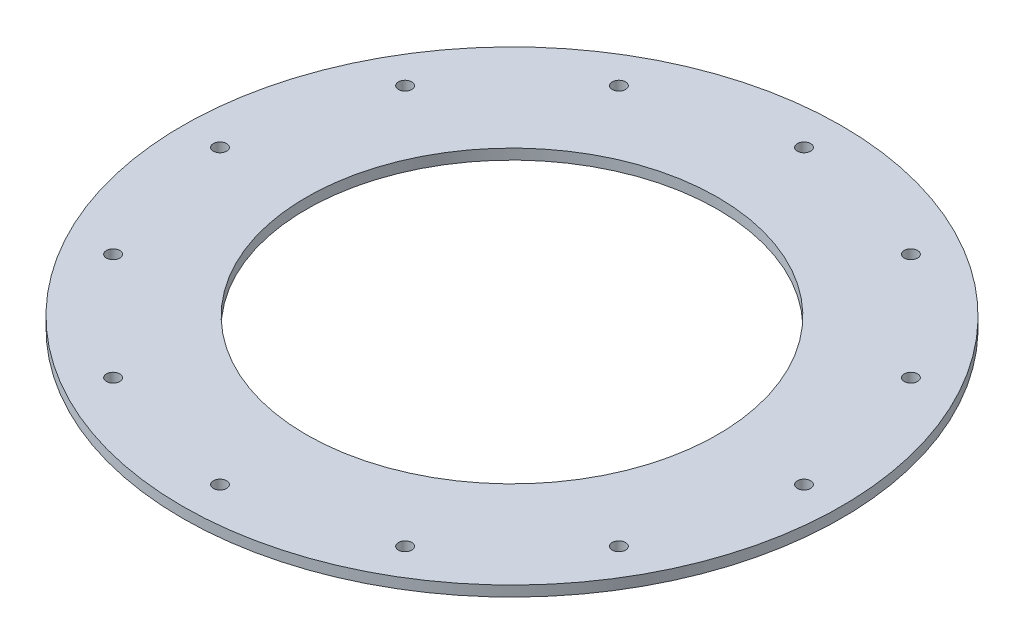
ISO-10303-21;
HEADER;
FILE_DESCRIPTION(('STEP AP214'),'2;1');
FILE_NAME('part.step','',(''),(''),'','','');
FILE_SCHEMA(('AUTOMOTIVE_DESIGN { 1 0 10303 214 1 1 1 1 }'));
ENDSEC;
DATA;
#1=APPLICATION_CONTEXT('core data for automotive mechanical design processes');
#2=APPLICATION_PROTOCOL_DEFINITION('international standard','automotive_design',2000,#1);
#3=PRODUCT_CONTEXT('',#1,'mechanical');
#4=PRODUCT('Part','Part','',(#3));
#5=PRODUCT_RELATED_PRODUCT_CATEGORY('part','',(#4));
#6=PRODUCT_DEFINITION_FORMATION('','',#4);
#7=PRODUCT_DEFINITION_CONTEXT('part definition',#1,'design');
#8=PRODUCT_DEFINITION('design','',#6,#7);
#9=PRODUCT_DEFINITION_SHAPE('','',#8);
#10=(LENGTH_UNIT() NAMED_UNIT(*) SI_UNIT(.MILLI.,.METRE.));
#11=(NAMED_UNIT(*) PLANE_ANGLE_UNIT() SI_UNIT($,.RADIAN.));
#12=(NAMED_UNIT(*) SI_UNIT($,.STERADIAN.) SOLID_ANGLE_UNIT());
#13=UNCERTAINTY_MEASURE_WITH_UNIT(LENGTH_MEASURE(1.E-05),#10,'distance_accuracy_value','');
#14=(GEOMETRIC_REPRESENTATION_CONTEXT(3) GLOBAL_UNCERTAINTY_ASSIGNED_CONTEXT((#13)) GLOBAL_UNIT_ASSIGNED_CONTEXT((#10,
#11,#12)) REPRESENTATION_CONTEXT('',''));
#15=CARTESIAN_POINT('',(0.,0.,0.));
#16=DIRECTION('',(0.,0.,1.));
#17=DIRECTION('',(1.,0.,0.));
#18=AXIS2_PLACEMENT_3D('',#15,#16,#17);
#19=CARTESIAN_POINT('',(0.,2.5,0.));
#20=DIRECTION('',(0.,1.,0.));
#21=DIRECTION('',(0.,0.,1.));
#22=AXIS2_PLACEMENT_3D('',#19,#20,#21);
#23=PLANE('',#22);
#24=CARTESIAN_POINT('',(35.0000000000011,2.5,-60.6217782649147));
#25=DIRECTION('',(0.,1.,0.));
#26=DIRECTION('',(0.,0.,1.));
#27=AXIS2_PLACEMENT_3D('',#24,#25,#26);
#28=CIRCLE('',#27,1.59999999999992);
#29=CARTESIAN_POINT('',(35.0000000000011,2.5,-59.0217782649148));
#30=VERTEX_POINT('',#29);
#31=EDGE_CURVE('E117',#30,#30,#28,.T.);
#32=ORIENTED_EDGE('',*,*,#31,.F.);
#33=EDGE_LOOP('',(#32));
#34=FACE_BOUND('',#33,.T.);
#35=CARTESIAN_POINT('',(60.6217782649147,2.5,-35.0000000000069));
#36=DIRECTION('',(0.,1.,0.));
#37=DIRECTION('',(0.,0.,1.));
#38=AXIS2_PLACEMENT_3D('',#35,#36,#37);
#39=CIRCLE('',#38,1.60000000000196);
#40=CARTESIAN_POINT('',(60.6217782649147,2.5,-33.4000000000049));
#41=VERTEX_POINT('',#40);
#42=EDGE_CURVE('E111',#41,#41,#39,.T.);
#43=ORIENTED_EDGE('',*,*,#42,.F.);
#44=EDGE_LOOP('',(#43));
#45=FACE_BOUND('',#44,.T.);
#46=CARTESIAN_POINT('',(70.000000000008,2.5,-7.94950611291909E-12));
#47=DIRECTION('',(0.,1.,0.));
#48=DIRECTION('',(0.,0.,1.));
#49=AXIS2_PLACEMENT_3D('',#46,#47,#48);
#50=CIRCLE('',#49,1.60000000000551);
#51=CARTESIAN_POINT('',(70.000000000008,2.5,1.59999999999756));
#52=VERTEX_POINT('',#51);
#53=EDGE_CURVE('E105',#52,#52,#50,.T.);
#54=ORIENTED_EDGE('',*,*,#53,.F.);
#55=EDGE_LOOP('',(#54));
#56=FACE_BOUND('',#55,.T.);
#57=CARTESIAN_POINT('',(60.6217782649226,2.5,34.9999999999931));
#58=DIRECTION('',(0.,1.,0.));
#59=DIRECTION('',(0.,0.,1.));
#60=AXIS2_PLACEMENT_3D('',#57,#58,#59);
#61=CIRCLE('',#60,1.60000000000973);
#62=CARTESIAN_POINT('',(60.6217782649226,2.5,36.6000000000028));
#63=VERTEX_POINT('',#62);
#64=EDGE_CURVE('E99',#63,#63,#61,.T.);
#65=ORIENTED_EDGE('',*,*,#64,.F.);
#66=EDGE_LOOP('',(#65));
#67=FACE_BOUND('',#66,.T.);
#68=CARTESIAN_POINT('',(35.0000000000149,2.5,60.6217782649067));
#69=DIRECTION('',(0.,1.,0.));
#70=DIRECTION('',(0.,0.,1.));
#71=AXIS2_PLACEMENT_3D('',#68,#69,#70);
#72=CIRCLE('',#71,1.60000000001344);
#73=CARTESIAN_POINT('',(35.0000000000149,2.5,62.2217782649202));
#74=VERTEX_POINT('',#73);
#75=EDGE_CURVE('E93',#74,#74,#72,.T.);
#76=ORIENTED_EDGE('',*,*,#75,.F.);
#77=EDGE_LOOP('',(#76));
#78=FACE_BOUND('',#77,.T.);
#79=CARTESIAN_POINT('',(1.58990122258382E-11,2.5,70.));
#80=DIRECTION('',(0.,1.,0.));
#81=DIRECTION('',(0.,0.,1.));
#82=AXIS2_PLACEMENT_3D('',#79,#80,#81);
#83=CIRCLE('',#82,1.60000000001567);
#84=CARTESIAN_POINT('',(1.58990122258382E-11,2.5,71.6000000000157));
#85=VERTEX_POINT('',#84);
#86=EDGE_CURVE('E87',#85,#85,#83,.T.);
#87=ORIENTED_EDGE('',*,*,#86,.F.);
#88=EDGE_LOOP('',(#87));
#89=FACE_BOUND('',#88,.T.);
#90=CARTESIAN_POINT('',(-34.9999999999852,2.5,60.6217782649147));
#91=DIRECTION('',(0.,1.,0.));
#92=DIRECTION('',(0.,0.,1.));
#93=AXIS2_PLACEMENT_3D('',#90,#91,#92);
#94=CIRCLE('',#93,1.6000000000159);
#95=CARTESIAN_POINT('',(-34.9999999999852,2.5,62.2217782649306));
#96=VERTEX_POINT('',#95);
#97=EDGE_CURVE('E81',#96,#96,#94,.T.);
#98=ORIENTED_EDGE('',*,*,#97,.F.);
#99=EDGE_LOOP('',(#98));
#100=FACE_BOUND('',#99,.T.);
#101=CARTESIAN_POINT('',(-60.6217782648988,2.5,35.0000000000069));
#102=DIRECTION('',(0.,1.,0.));
#103=DIRECTION('',(0.,0.,1.));
#104=AXIS2_PLACEMENT_3D('',#101,#102,#103);
#105=CIRCLE('',#104,1.60000000001406);
#106=CARTESIAN_POINT('',(-60.6217782648988,2.5,36.600000000021));
#107=VERTEX_POINT('',#106);
#108=EDGE_CURVE('E75',#107,#107,#105,.T.);
#109=ORIENTED_EDGE('',*,*,#108,.F.);
#110=EDGE_LOOP('',(#109));
#111=FACE_BOUND('',#110,.T.);
#112=CARTESIAN_POINT('',(-69.9999999999921,2.5,7.95807864051312E-12));
#113=DIRECTION('',(0.,1.,0.));
#114=DIRECTION('',(0.,0.,1.));
#115=AXIS2_PLACEMENT_3D('',#112,#113,#114);
#116=CIRCLE('',#115,1.60000000001064);
#117=CARTESIAN_POINT('',(-69.9999999999921,2.5,1.6000000000186));
#118=VERTEX_POINT('',#117);
#119=EDGE_CURVE('E69',#118,#118,#116,.T.);
#120=ORIENTED_EDGE('',*,*,#119,.F.);
#121=EDGE_LOOP('',(#120));
#122=FACE_BOUND('',#121,.T.);
#123=CARTESIAN_POINT('',(-60.6217782649068,2.5,-34.9999999999931));
#124=DIRECTION('',(0.,1.,0.));
#125=DIRECTION('',(0.,0.,1.));
#126=AXIS2_PLACEMENT_3D('',#123,#124,#125);
#127=CIRCLE('',#126,1.60000000000665);
#128=CARTESIAN_POINT('',(-60.6217782649068,2.5,-33.3999999999864));
#129=VERTEX_POINT('',#128);
#130=EDGE_CURVE('E63',#129,#129,#127,.T.);
#131=ORIENTED_EDGE('',*,*,#130,.F.);
#132=EDGE_LOOP('',(#131));
#133=FACE_BOUND('',#132,.T.);
#134=CARTESIAN_POINT('',(-34.999999999999,2.5,-60.6217782649067));
#135=DIRECTION('',(0.,1.,0.));
#136=DIRECTION('',(0.,0.,1.));
#137=AXIS2_PLACEMENT_3D('',#134,#135,#136);
#138=CIRCLE('',#137,1.60000000000308);
#139=CARTESIAN_POINT('',(-34.999999999999,2.5,-59.0217782649036));
#140=VERTEX_POINT('',#139);
#141=EDGE_CURVE('E57',#140,#140,#138,.T.);
#142=ORIENTED_EDGE('',*,*,#141,.F.);
#143=EDGE_LOOP('',(#142));
#144=FACE_BOUND('',#143,.T.);
#145=CARTESIAN_POINT('',(0.,2.5,-70.));
#146=DIRECTION('',(0.,1.,0.));
#147=DIRECTION('',(0.,0.,1.));
#148=AXIS2_PLACEMENT_3D('',#145,#146,#147);
#149=CIRCLE('',#148,1.6);
#150=CARTESIAN_POINT('',(0.,2.5,-68.4));
#151=VERTEX_POINT('',#150);
#152=EDGE_CURVE('E51',#151,#151,#149,.T.);
#153=ORIENTED_EDGE('',*,*,#152,.F.);
#154=EDGE_LOOP('',(#153));
#155=FACE_BOUND('',#154,.T.);
#156=CARTESIAN_POINT('',(0.,2.5,0.));
#157=DIRECTION('',(0.,1.,0.));
#158=DIRECTION('',(0.,0.,1.));
#159=AXIS2_PLACEMENT_3D('',#156,#157,#158);
#160=CIRCLE('',#159,79.);
#161=CARTESIAN_POINT('',(0.,2.5,79.));
#162=VERTEX_POINT('',#161);
#163=EDGE_CURVE('E10',#162,#162,#160,.T.);
#164=ORIENTED_EDGE('',*,*,#163,.T.);
#165=EDGE_LOOP('',(#164));
#166=FACE_BOUND('',#165,.T.);
#167=CARTESIAN_POINT('',(0.,2.5,0.));
#168=DIRECTION('',(0.,1.,0.));
#169=DIRECTION('',(0.,0.,1.));
#170=AXIS2_PLACEMENT_3D('',#167,#168,#169);
#171=CIRCLE('',#170,49.3);
#172=CARTESIAN_POINT('',(0.,2.5,49.3));
#173=VERTEX_POINT('',#172);
#174=EDGE_CURVE('E43',#173,#173,#171,.T.);
#175=ORIENTED_EDGE('',*,*,#174,.F.);
#176=EDGE_LOOP('',(#175));
#177=FACE_BOUND('',#176,.T.);
#178=ADVANCED_FACE('F32',(#34,#45,#56,#67,#78,#89,#100,#111,#122,#133,#144,#155,#166,#177),#23,.T.);
#179=CARTESIAN_POINT('',(0.,0.,0.));
#180=DIRECTION('',(0.,1.,0.));
#181=DIRECTION('',(0.,0.,1.));
#182=AXIS2_PLACEMENT_3D('',#179,#180,#181);
#183=PLANE('',#182);
#184=CARTESIAN_POINT('',(35.0000000000011,0.,-60.6217782649147));
#185=DIRECTION('',(0.,1.,0.));
#186=DIRECTION('',(0.,0.,1.));
#187=AXIS2_PLACEMENT_3D('',#184,#185,#186);
#188=CIRCLE('',#187,1.59999999999992);
#189=CARTESIAN_POINT('',(35.0000000000011,0.,-59.0217782649148));
#190=VERTEX_POINT('',#189);
#191=EDGE_CURVE('E54',#190,#190,#188,.T.);
#192=ORIENTED_EDGE('',*,*,#191,.T.);
#193=EDGE_LOOP('',(#192));
#194=FACE_BOUND('',#193,.T.);
#195=CARTESIAN_POINT('',(60.6217782649147,0.,-35.0000000000069));
#196=DIRECTION('',(0.,1.,0.));
#197=DIRECTION('',(0.,0.,1.));
#198=AXIS2_PLACEMENT_3D('',#195,#196,#197);
#199=CIRCLE('',#198,1.60000000000196);
#200=CARTESIAN_POINT('',(60.6217782649147,0.,-33.4000000000049));
#201=VERTEX_POINT('',#200);
#202=EDGE_CURVE('E114',#201,#201,#199,.T.);
#203=ORIENTED_EDGE('',*,*,#202,.T.);
#204=EDGE_LOOP('',(#203));
#205=FACE_BOUND('',#204,.T.);
#206=CARTESIAN_POINT('',(70.000000000008,0.,-7.94950611291909E-12));
#207=DIRECTION('',(0.,1.,0.));
#208=DIRECTION('',(0.,0.,1.));
#209=AXIS2_PLACEMENT_3D('',#206,#207,#208);
#210=CIRCLE('',#209,1.60000000000551);
#211=CARTESIAN_POINT('',(70.000000000008,0.,1.59999999999756));
#212=VERTEX_POINT('',#211);
#213=EDGE_CURVE('E108',#212,#212,#210,.T.);
#214=ORIENTED_EDGE('',*,*,#213,.T.);
#215=EDGE_LOOP('',(#214));
#216=FACE_BOUND('',#215,.T.);
#217=CARTESIAN_POINT('',(60.6217782649226,0.,34.9999999999931));
#218=DIRECTION('',(0.,1.,0.));
#219=DIRECTION('',(0.,0.,1.));
#220=AXIS2_PLACEMENT_3D('',#217,#218,#219);
#221=CIRCLE('',#220,1.60000000000973);
#222=CARTESIAN_POINT('',(60.6217782649226,0.,36.6000000000028));
#223=VERTEX_POINT('',#222);
#224=EDGE_CURVE('E102',#223,#223,#221,.T.);
#225=ORIENTED_EDGE('',*,*,#224,.T.);
#226=EDGE_LOOP('',(#225));
#227=FACE_BOUND('',#226,.T.);
#228=CARTESIAN_POINT('',(35.0000000000149,0.,60.6217782649067));
#229=DIRECTION('',(0.,1.,0.));
#230=DIRECTION('',(0.,0.,1.));
#231=AXIS2_PLACEMENT_3D('',#228,#229,#230);
#232=CIRCLE('',#231,1.60000000001344);
#233=CARTESIAN_POINT('',(35.0000000000149,0.,62.2217782649202));
#234=VERTEX_POINT('',#233);
#235=EDGE_CURVE('E96',#234,#234,#232,.T.);
#236=ORIENTED_EDGE('',*,*,#235,.T.);
#237=EDGE_LOOP('',(#236));
#238=FACE_BOUND('',#237,.T.);
#239=CARTESIAN_POINT('',(1.58990122258382E-11,0.,70.));
#240=DIRECTION('',(0.,1.,0.));
#241=DIRECTION('',(0.,0.,1.));
#242=AXIS2_PLACEMENT_3D('',#239,#240,#241);
#243=CIRCLE('',#242,1.60000000001567);
#244=CARTESIAN_POINT('',(1.58990122258382E-11,0.,71.6000000000157));
#245=VERTEX_POINT('',#244);
#246=EDGE_CURVE('E90',#245,#245,#243,.T.);
#247=ORIENTED_EDGE('',*,*,#246,.T.);
#248=EDGE_LOOP('',(#247));
#249=FACE_BOUND('',#248,.T.);
#250=CARTESIAN_POINT('',(-34.9999999999852,0.,60.6217782649147));
#251=DIRECTION('',(0.,1.,0.));
#252=DIRECTION('',(0.,0.,1.));
#253=AXIS2_PLACEMENT_3D('',#250,#251,#252);
#254=CIRCLE('',#253,1.6000000000159);
#255=CARTESIAN_POINT('',(-34.9999999999852,0.,62.2217782649306));
#256=VERTEX_POINT('',#255);
#257=EDGE_CURVE('E84',#256,#256,#254,.T.);
#258=ORIENTED_EDGE('',*,*,#257,.T.);
#259=EDGE_LOOP('',(#258));
#260=FACE_BOUND('',#259,.T.);
#261=CARTESIAN_POINT('',(-60.6217782648988,0.,35.0000000000069));
#262=DIRECTION('',(0.,1.,0.));
#263=DIRECTION('',(0.,0.,1.));
#264=AXIS2_PLACEMENT_3D('',#261,#262,#263);
#265=CIRCLE('',#264,1.60000000001406);
#266=CARTESIAN_POINT('',(-60.6217782648988,0.,36.600000000021));
#267=VERTEX_POINT('',#266);
#268=EDGE_CURVE('E78',#267,#267,#265,.T.);
#269=ORIENTED_EDGE('',*,*,#268,.T.);
#270=EDGE_LOOP('',(#269));
#271=FACE_BOUND('',#270,.T.);
#272=CARTESIAN_POINT('',(-69.9999999999921,0.,7.95807864051312E-12));
#273=DIRECTION('',(0.,1.,0.));
#274=DIRECTION('',(0.,0.,1.));
#275=AXIS2_PLACEMENT_3D('',#272,#273,#274);
#276=CIRCLE('',#275,1.60000000001064);
#277=CARTESIAN_POINT('',(-69.9999999999921,0.,1.6000000000186));
#278=VERTEX_POINT('',#277);
#279=EDGE_CURVE('E72',#278,#278,#276,.T.);
#280=ORIENTED_EDGE('',*,*,#279,.T.);
#281=EDGE_LOOP('',(#280));
#282=FACE_BOUND('',#281,.T.);
#283=CARTESIAN_POINT('',(-60.6217782649068,0.,-34.9999999999931));
#284=DIRECTION('',(0.,1.,0.));
#285=DIRECTION('',(0.,0.,1.));
#286=AXIS2_PLACEMENT_3D('',#283,#284,#285);
#287=CIRCLE('',#286,1.60000000000665);
#288=CARTESIAN_POINT('',(-60.6217782649068,0.,-33.3999999999864));
#289=VERTEX_POINT('',#288);
#290=EDGE_CURVE('E66',#289,#289,#287,.T.);
#291=ORIENTED_EDGE('',*,*,#290,.T.);
#292=EDGE_LOOP('',(#291));
#293=FACE_BOUND('',#292,.T.);
#294=CARTESIAN_POINT('',(-34.999999999999,0.,-60.6217782649067));
#295=DIRECTION('',(0.,1.,0.));
#296=DIRECTION('',(0.,0.,1.));
#297=AXIS2_PLACEMENT_3D('',#294,#295,#296);
#298=CIRCLE('',#297,1.60000000000308);
#299=CARTESIAN_POINT('',(-34.999999999999,0.,-59.0217782649036));
#300=VERTEX_POINT('',#299);
#301=EDGE_CURVE('E60',#300,#300,#298,.T.);
#302=ORIENTED_EDGE('',*,*,#301,.T.);
#303=EDGE_LOOP('',(#302));
#304=FACE_BOUND('',#303,.T.);
#305=CARTESIAN_POINT('',(0.,0.,-70.));
#306=DIRECTION('',(0.,1.,0.));
#307=DIRECTION('',(0.,0.,1.));
#308=AXIS2_PLACEMENT_3D('',#305,#306,#307);
#309=CIRCLE('',#308,1.6);
#310=CARTESIAN_POINT('',(0.,0.,-68.4));
#311=VERTEX_POINT('',#310);
#312=EDGE_CURVE('E48',#311,#311,#309,.T.);
#313=ORIENTED_EDGE('',*,*,#312,.T.);
#314=EDGE_LOOP('',(#313));
#315=FACE_BOUND('',#314,.T.);
#316=CARTESIAN_POINT('',(0.,0.,0.));
#317=DIRECTION('',(0.,1.,0.));
#318=DIRECTION('',(0.,0.,1.));
#319=AXIS2_PLACEMENT_3D('',#316,#317,#318);
#320=CIRCLE('',#319,79.);
#321=CARTESIAN_POINT('',(0.,0.,79.));
#322=VERTEX_POINT('',#321);
#323=EDGE_CURVE('E36',#322,#322,#320,.T.);
#324=ORIENTED_EDGE('',*,*,#323,.F.);
#325=EDGE_LOOP('',(#324));
#326=FACE_BOUND('',#325,.T.);
#327=CARTESIAN_POINT('',(0.,0.,0.));
#328=DIRECTION('',(0.,1.,0.));
#329=DIRECTION('',(0.,0.,1.));
#330=AXIS2_PLACEMENT_3D('',#327,#328,#329);
#331=CIRCLE('',#330,49.3);
#332=CARTESIAN_POINT('',(0.,0.,49.3));
#333=VERTEX_POINT('',#332);
#334=EDGE_CURVE('E45',#333,#333,#331,.T.);
#335=ORIENTED_EDGE('',*,*,#334,.T.);
#336=EDGE_LOOP('',(#335));
#337=FACE_BOUND('',#336,.T.);
#338=ADVANCED_FACE('F123',(#194,#205,#216,#227,#238,#249,#260,#271,#282,#293,#304,#315,#326,
#337),#183,.F.);
#339=CARTESIAN_POINT('',(0.,2.5,0.));
#340=DIRECTION('',(0.,-1.,0.));
#341=DIRECTION('',(0.,0.,-1.));
#342=AXIS2_PLACEMENT_3D('',#339,#340,#341);
#343=CYLINDRICAL_SURFACE('',#342,79.);
#344=ORIENTED_EDGE('',*,*,#163,.F.);
#345=EDGE_LOOP('',(#344));
#346=FACE_BOUND('',#345,.T.);
#347=ORIENTED_EDGE('',*,*,#323,.T.);
#348=EDGE_LOOP('',(#347));
#349=FACE_BOUND('',#348,.T.);
#350=ADVANCED_FACE('F34',(#346,#349),#343,.T.);
#351=CARTESIAN_POINT('',(0.,2.5,0.));
#352=DIRECTION('',(0.,-1.,0.));
#353=DIRECTION('',(0.,0.,-1.));
#354=AXIS2_PLACEMENT_3D('',#351,#352,#353);
#355=CYLINDRICAL_SURFACE('',#354,49.3);
#356=ORIENTED_EDGE('',*,*,#174,.T.);
#357=EDGE_LOOP('',(#356));
#358=FACE_BOUND('',#357,.T.);
#359=ORIENTED_EDGE('',*,*,#334,.F.);
#360=EDGE_LOOP('',(#359));
#361=FACE_BOUND('',#360,.T.);
#362=ADVANCED_FACE('F160',(#358,#361),#355,.F.);
#363=CARTESIAN_POINT('',(0.,0.,-70.));
#364=DIRECTION('',(0.,1.,0.));
#365=DIRECTION('',(0.,0.,1.));
#366=AXIS2_PLACEMENT_3D('',#363,#364,#365);
#367=CYLINDRICAL_SURFACE('',#366,1.6);
#368=ORIENTED_EDGE('',*,*,#312,.F.);
#369=EDGE_LOOP('',(#368));
#370=FACE_BOUND('',#369,.T.);
#371=ORIENTED_EDGE('',*,*,#152,.T.);
#372=EDGE_LOOP('',(#371));
#373=FACE_BOUND('',#372,.T.);
#374=ADVANCED_FACE('F163',(#370,#373),#367,.F.);
#375=CARTESIAN_POINT('',(-34.999999999999,0.,-60.6217782649067));
#376=DIRECTION('',(0.,1.,0.));
#377=DIRECTION('',(0.,0.,1.));
#378=AXIS2_PLACEMENT_3D('',#375,#376,#377);
#379=CYLINDRICAL_SURFACE('',#378,1.60000000000308);
#380=ORIENTED_EDGE('',*,*,#301,.F.);
#381=EDGE_LOOP('',(#380));
#382=FACE_BOUND('',#381,.T.);
#383=ORIENTED_EDGE('',*,*,#141,.T.);
#384=EDGE_LOOP('',(#383));
#385=FACE_BOUND('',#384,.T.);
#386=ADVANCED_FACE('F175',(#382,#385),#379,.F.);
#387=CARTESIAN_POINT('',(-60.6217782649068,0.,-34.9999999999931));
#388=DIRECTION('',(0.,1.,0.));
#389=DIRECTION('',(0.,0.,1.));
#390=AXIS2_PLACEMENT_3D('',#387,#388,#389);
#391=CYLINDRICAL_SURFACE('',#390,1.60000000000665);
#392=ORIENTED_EDGE('',*,*,#290,.F.);
#393=EDGE_LOOP('',(#392));
#394=FACE_BOUND('',#393,.T.);
#395=ORIENTED_EDGE('',*,*,#130,.T.);
#396=EDGE_LOOP('',(#395));
#397=FACE_BOUND('',#396,.T.);
#398=ADVANCED_FACE('F179',(#394,#397),#391,.F.);
#399=CARTESIAN_POINT('',(-69.9999999999921,0.,7.95807864051312E-12));
#400=DIRECTION('',(0.,1.,0.));
#401=DIRECTION('',(0.,0.,1.));
#402=AXIS2_PLACEMENT_3D('',#399,#400,#401);
#403=CYLINDRICAL_SURFACE('',#402,1.60000000001064);
#404=ORIENTED_EDGE('',*,*,#279,.F.);
#405=EDGE_LOOP('',(#404));
#406=FACE_BOUND('',#405,.T.);
#407=ORIENTED_EDGE('',*,*,#119,.T.);
#408=EDGE_LOOP('',(#407));
#409=FACE_BOUND('',#408,.T.);
#410=ADVANCED_FACE('F183',(#406,#409),#403,.F.);
#411=CARTESIAN_POINT('',(-60.6217782648988,0.,35.0000000000069));
#412=DIRECTION('',(0.,1.,0.));
#413=DIRECTION('',(0.,0.,1.));
#414=AXIS2_PLACEMENT_3D('',#411,#412,#413);
#415=CYLINDRICAL_SURFACE('',#414,1.60000000001406);
#416=ORIENTED_EDGE('',*,*,#268,.F.);
#417=EDGE_LOOP('',(#416));
#418=FACE_BOUND('',#417,.T.);
#419=ORIENTED_EDGE('',*,*,#108,.T.);
#420=EDGE_LOOP('',(#419));
#421=FACE_BOUND('',#420,.T.);
#422=ADVANCED_FACE('F187',(#418,#421),#415,.F.);
#423=CARTESIAN_POINT('',(-34.9999999999852,0.,60.6217782649147));
#424=DIRECTION('',(0.,1.,0.));
#425=DIRECTION('',(0.,0.,1.));
#426=AXIS2_PLACEMENT_3D('',#423,#424,#425);
#427=CYLINDRICAL_SURFACE('',#426,1.6000000000159);
#428=ORIENTED_EDGE('',*,*,#257,.F.);
#429=EDGE_LOOP('',(#428));
#430=FACE_BOUND('',#429,.T.);
#431=ORIENTED_EDGE('',*,*,#97,.T.);
#432=EDGE_LOOP('',(#431));
#433=FACE_BOUND('',#432,.T.);
#434=ADVANCED_FACE('F191',(#430,#433),#427,.F.);
#435=CARTESIAN_POINT('',(1.58990122258382E-11,0.,70.));
#436=DIRECTION('',(0.,1.,0.));
#437=DIRECTION('',(0.,0.,1.));
#438=AXIS2_PLACEMENT_3D('',#435,#436,#437);
#439=CYLINDRICAL_SURFACE('',#438,1.60000000001567);
#440=ORIENTED_EDGE('',*,*,#246,.F.);
#441=EDGE_LOOP('',(#440));
#442=FACE_BOUND('',#441,.T.);
#443=ORIENTED_EDGE('',*,*,#86,.T.);
#444=EDGE_LOOP('',(#443));
#445=FACE_BOUND('',#444,.T.);
#446=ADVANCED_FACE('F195',(#442,#445),#439,.F.);
#447=CARTESIAN_POINT('',(35.0000000000149,0.,60.6217782649067));
#448=DIRECTION('',(0.,1.,0.));
#449=DIRECTION('',(0.,0.,1.));
#450=AXIS2_PLACEMENT_3D('',#447,#448,#449);
#451=CYLINDRICAL_SURFACE('',#450,1.60000000001344);
#452=ORIENTED_EDGE('',*,*,#235,.F.);
#453=EDGE_LOOP('',(#452));
#454=FACE_BOUND('',#453,.T.);
#455=ORIENTED_EDGE('',*,*,#75,.T.);
#456=EDGE_LOOP('',(#455));
#457=FACE_BOUND('',#456,.T.);
#458=ADVANCED_FACE('F199',(#454,#457),#451,.F.);
#459=CARTESIAN_POINT('',(60.6217782649226,0.,34.9999999999931));
#460=DIRECTION('',(0.,1.,0.));
#461=DIRECTION('',(0.,0.,1.));
#462=AXIS2_PLACEMENT_3D('',#459,#460,#461);
#463=CYLINDRICAL_SURFACE('',#462,1.60000000000973);
#464=ORIENTED_EDGE('',*,*,#224,.F.);
#465=EDGE_LOOP('',(#464));
#466=FACE_BOUND('',#465,.T.);
#467=ORIENTED_EDGE('',*,*,#64,.T.);
#468=EDGE_LOOP('',(#467));
#469=FACE_BOUND('',#468,.T.);
#470=ADVANCED_FACE('F203',(#466,#469),#463,.F.);
#471=CARTESIAN_POINT('',(70.000000000008,0.,-7.94950611291909E-12));
#472=DIRECTION('',(0.,1.,0.));
#473=DIRECTION('',(0.,0.,1.));
#474=AXIS2_PLACEMENT_3D('',#471,#472,#473);
#475=CYLINDRICAL_SURFACE('',#474,1.60000000000551);
#476=ORIENTED_EDGE('',*,*,#213,.F.);
#477=EDGE_LOOP('',(#476));
#478=FACE_BOUND('',#477,.T.);
#479=ORIENTED_EDGE('',*,*,#53,.T.);
#480=EDGE_LOOP('',(#479));
#481=FACE_BOUND('',#480,.T.);
#482=ADVANCED_FACE('F207',(#478,#481),#475,.F.);
#483=CARTESIAN_POINT('',(60.6217782649147,0.,-35.0000000000069));
#484=DIRECTION('',(0.,1.,0.));
#485=DIRECTION('',(0.,0.,1.));
#486=AXIS2_PLACEMENT_3D('',#483,#484,#485);
#487=CYLINDRICAL_SURFACE('',#486,1.60000000000196);
#488=ORIENTED_EDGE('',*,*,#202,.F.);
#489=EDGE_LOOP('',(#488));
#490=FACE_BOUND('',#489,.T.);
#491=ORIENTED_EDGE('',*,*,#42,.T.);
#492=EDGE_LOOP('',(#491));
#493=FACE_BOUND('',#492,.T.);
#494=ADVANCED_FACE('F129',(#490,#493),#487,.F.);
#495=CARTESIAN_POINT('',(35.0000000000011,0.,-60.6217782649147));
#496=DIRECTION('',(0.,1.,0.));
#497=DIRECTION('',(0.,0.,1.));
#498=AXIS2_PLACEMENT_3D('',#495,#496,#497);
#499=CYLINDRICAL_SURFACE('',#498,1.59999999999992);
#500=ORIENTED_EDGE('',*,*,#191,.F.);
#501=EDGE_LOOP('',(#500));
#502=FACE_BOUND('',#501,.T.);
#503=ORIENTED_EDGE('',*,*,#31,.T.);
#504=EDGE_LOOP('',(#503));
#505=FACE_BOUND('',#504,.T.);
#506=ADVANCED_FACE('F126',(#502,#505),#499,.F.);
#507=CLOSED_SHELL('',(#178,#338,#350,#362,#374,#386,#398,#410,#422,#434,#446,#458,#470,#482,
#494,#506));
#508=MANIFOLD_SOLID_BREP('B2',#507);
#509=ADVANCED_BREP_SHAPE_REPRESENTATION('',(#18,#508),#14);
#510=SHAPE_DEFINITION_REPRESENTATION(#9,#509);
ENDSEC;
END-ISO-10303-21;
